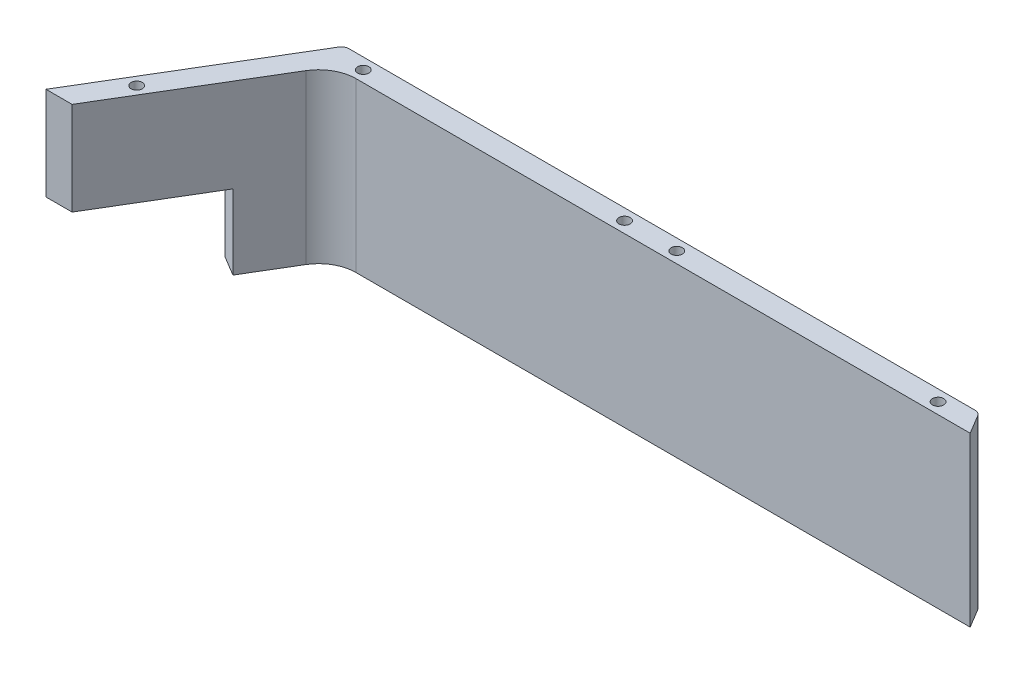
ISO-10303-21;
HEADER;
FILE_DESCRIPTION(('STEP AP214'),'2;1');
FILE_NAME('part.step','',(''),(''),'','','');
FILE_SCHEMA(('AUTOMOTIVE_DESIGN { 1 0 10303 214 1 1 1 1 }'));
ENDSEC;
DATA;
#1=APPLICATION_CONTEXT('core data for automotive mechanical design processes');
#2=APPLICATION_PROTOCOL_DEFINITION('international standard','automotive_design',2000,#1);
#3=PRODUCT_CONTEXT('',#1,'mechanical');
#4=PRODUCT('Part','Part','',(#3));
#5=PRODUCT_RELATED_PRODUCT_CATEGORY('part','',(#4));
#6=PRODUCT_DEFINITION_FORMATION('','',#4);
#7=PRODUCT_DEFINITION_CONTEXT('part definition',#1,'design');
#8=PRODUCT_DEFINITION('design','',#6,#7);
#9=PRODUCT_DEFINITION_SHAPE('','',#8);
#10=(LENGTH_UNIT() NAMED_UNIT(*) SI_UNIT(.MILLI.,.METRE.));
#11=(NAMED_UNIT(*) PLANE_ANGLE_UNIT() SI_UNIT($,.RADIAN.));
#12=(NAMED_UNIT(*) SI_UNIT($,.STERADIAN.) SOLID_ANGLE_UNIT());
#13=UNCERTAINTY_MEASURE_WITH_UNIT(LENGTH_MEASURE(1.E-05),#10,'distance_accuracy_value','');
#14=(GEOMETRIC_REPRESENTATION_CONTEXT(3) GLOBAL_UNCERTAINTY_ASSIGNED_CONTEXT((#13)) GLOBAL_UNIT_ASSIGNED_CONTEXT((#10,
#11,#12)) REPRESENTATION_CONTEXT('',''));
#15=CARTESIAN_POINT('',(0.,0.,0.));
#16=DIRECTION('',(0.,0.,1.));
#17=DIRECTION('',(1.,0.,0.));
#18=AXIS2_PLACEMENT_3D('',#15,#16,#17);
#19=CARTESIAN_POINT('',(0.,-22.5,0.));
#20=DIRECTION('',(0.,-1.,0.));
#21=DIRECTION('',(0.,0.,-1.));
#22=AXIS2_PLACEMENT_3D('',#19,#20,#21);
#23=PLANE('',#22);
#24=DIRECTION('',(-0.514495755427526,0.,-0.857492925712544));
#25=VECTOR('',#24,1.);
#26=CARTESIAN_POINT('',(115.,-22.5,1.74329600357084E-13));
#27=LINE('',#26,#25);
#28=CARTESIAN_POINT('',(88.6,-22.5,-43.9999999999998));
#29=VERTEX_POINT('',#28);
#30=CARTESIAN_POINT('',(85.582605093487,-22.5,-49.0289915108549));
#31=VERTEX_POINT('',#30);
#32=EDGE_CURVE('E160',#29,#31,#27,.T.);
#33=ORIENTED_EDGE('',*,*,#32,.F.);
#34=DIRECTION('',(1.,0.,0.));
#35=VECTOR('',#34,1.);
#36=CARTESIAN_POINT('',(81.6,-22.5,-43.9999999999998));
#37=LINE('',#36,#35);
#38=CARTESIAN_POINT('',(-75.9380962103094,-22.5,-43.9999999999998));
#39=VERTEX_POINT('',#38);
#40=EDGE_CURVE('E132',#39,#29,#37,.T.);
#41=ORIENTED_EDGE('',*,*,#40,.F.);
#42=CARTESIAN_POINT('',(-75.9380962103094,-22.5,-33.9999999999998));
#43=DIRECTION('',(0.,-1.,0.));
#44=DIRECTION('',(0.,0.,-1.));
#45=AXIS2_PLACEMENT_3D('',#42,#43,#44);
#46=CIRCLE('',#45,10.);
#47=CARTESIAN_POINT('',(-84.5130254674349,-22.5,-39.1449575542751));
#48=VERTEX_POINT('',#47);
#49=EDGE_CURVE('E50',#39,#48,#46,.F.);
#50=ORIENTED_EDGE('',*,*,#49,.T.);
#51=DIRECTION('',(0.514495755427526,0.,-0.857492925712545));
#52=VECTOR('',#51,1.);
#53=CARTESIAN_POINT('',(-81.6,-22.5,-43.9999999999998));
#54=LINE('',#53,#52);
#55=CARTESIAN_POINT('',(-91.8455897365072,-22.5,-26.9240171058212));
#56=VERTEX_POINT('',#55);
#57=EDGE_CURVE('E155',#56,#48,#54,.T.);
#58=ORIENTED_EDGE('',*,*,#57,.F.);
#59=DIRECTION('',(-0.857492925712544,0.,-0.514495755427526));
#60=VECTOR('',#59,1.);
#61=CARTESIAN_POINT('',(-88.4177193029112,-22.5,-24.8672948456636));
#62=LINE('',#61,#60);
#63=CARTESIAN_POINT('',(-96.9926485600366,-22.5,-30.0122523999389));
#64=VERTEX_POINT('',#63);
#65=EDGE_CURVE('E186',#56,#64,#62,.T.);
#66=ORIENTED_EDGE('',*,*,#65,.T.);
#67=DIRECTION('',(-0.514495755427526,0.,0.857492925712544));
#68=VECTOR('',#67,1.);
#69=CARTESIAN_POINT('',(-115.,-22.5,1.74329600357084E-13));
#70=LINE('',#69,#68);
#71=CARTESIAN_POINT('',(-85.582605093487,-22.5,-49.0289915108549));
#72=VERTEX_POINT('',#71);
#73=EDGE_CURVE('E162',#72,#64,#70,.T.);
#74=ORIENTED_EDGE('',*,*,#73,.F.);
#75=CARTESIAN_POINT('',(-83.8676192420619,-22.5,-47.9999999999998));
#76=DIRECTION('',(0.,-1.,0.));
#77=DIRECTION('',(0.,0.,-1.));
#78=AXIS2_PLACEMENT_3D('',#75,#76,#77);
#79=CIRCLE('',#78,2.);
#80=CARTESIAN_POINT('',(-83.8676192420619,-22.5,-49.9999999999998));
#81=VERTEX_POINT('',#80);
#82=EDGE_CURVE('E176',#72,#81,#79,.T.);
#83=ORIENTED_EDGE('',*,*,#82,.T.);
#84=DIRECTION('',(-1.,0.,0.));
#85=VECTOR('',#84,1.);
#86=CARTESIAN_POINT('',(-85.,-22.5,-49.9999999999998));
#87=LINE('',#86,#85);
#88=CARTESIAN_POINT('',(83.8676192420619,-22.5,-49.9999999999998));
#89=VERTEX_POINT('',#88);
#90=EDGE_CURVE('E156',#89,#81,#87,.T.);
#91=ORIENTED_EDGE('',*,*,#90,.F.);
#92=CARTESIAN_POINT('',(83.8676192420619,-22.5,-47.9999999999998));
#93=DIRECTION('',(0.,-1.,0.));
#94=DIRECTION('',(0.,0.,-1.));
#95=AXIS2_PLACEMENT_3D('',#92,#93,#94);
#96=CIRCLE('',#95,2.);
#97=EDGE_CURVE('E178',#89,#31,#96,.T.);
#98=ORIENTED_EDGE('',*,*,#97,.T.);
#99=EDGE_LOOP('',(#33,#41,#50,#58,#66,#74,#83,#91,#98));
#100=FACE_BOUND('',#99,.T.);
#101=ADVANCED_FACE('F39',(#100),#23,.T.);
#102=CARTESIAN_POINT('',(115.,22.5,1.74329600357084E-13));
#103=DIRECTION('',(-0.857492925712544,0.,0.514495755427526));
#104=DIRECTION('',(0.514495755427526,0.,0.857492925712544));
#105=AXIS2_PLACEMENT_3D('',#102,#103,#104);
#106=PLANE('',#105);
#107=DIRECTION('',(0.,1.,0.));
#108=VECTOR('',#107,1.);
#109=CARTESIAN_POINT('',(88.6,22.5,-43.9999999999998));
#110=LINE('',#109,#108);
#111=CARTESIAN_POINT('',(88.6,22.5,-43.9999999999998));
#112=VERTEX_POINT('',#111);
#113=EDGE_CURVE('E135',#29,#112,#110,.T.);
#114=ORIENTED_EDGE('',*,*,#113,.F.);
#115=ORIENTED_EDGE('',*,*,#32,.T.);
#116=DIRECTION('',(0.,-1.,0.));
#117=VECTOR('',#116,1.);
#118=CARTESIAN_POINT('',(85.582605093487,22.5,-49.0289915108549));
#119=LINE('',#118,#117);
#120=CARTESIAN_POINT('',(85.582605093487,22.5,-49.0289915108549));
#121=VERTEX_POINT('',#120);
#122=EDGE_CURVE('E145',#31,#121,#119,.F.);
#123=ORIENTED_EDGE('',*,*,#122,.T.);
#124=DIRECTION('',(-0.514495755427526,0.,-0.857492925712544));
#125=VECTOR('',#124,1.);
#126=CARTESIAN_POINT('',(115.,22.5,1.74329600357084E-13));
#127=LINE('',#126,#125);
#128=EDGE_CURVE('E121',#112,#121,#127,.T.);
#129=ORIENTED_EDGE('',*,*,#128,.F.);
#130=EDGE_LOOP('',(#114,#115,#123,#129));
#131=FACE_BOUND('',#130,.T.);
#132=ADVANCED_FACE('F138',(#131),#106,.F.);
#133=CARTESIAN_POINT('',(0.,22.5,0.));
#134=DIRECTION('',(0.,-1.,0.));
#135=DIRECTION('',(0.,0.,-1.));
#136=AXIS2_PLACEMENT_3D('',#133,#134,#135);
#137=PLANE('',#136);
#138=CARTESIAN_POINT('',(77.,22.5,-46.9999999999998));
#139=DIRECTION('',(0.,1.,0.));
#140=DIRECTION('',(0.,0.,-1.));
#141=AXIS2_PLACEMENT_3D('',#138,#139,#140);
#142=CIRCLE('',#141,1.5);
#143=CARTESIAN_POINT('',(77.,22.5,-48.4999999999998));
#144=VERTEX_POINT('',#143);
#145=EDGE_CURVE('E226',#144,#144,#142,.T.);
#146=ORIENTED_EDGE('',*,*,#145,.F.);
#147=EDGE_LOOP('',(#146));
#148=FACE_BOUND('',#147,.T.);
#149=CARTESIAN_POINT('',(7.00000000000001,22.5,-46.9999999999998));
#150=DIRECTION('',(0.,1.,0.));
#151=DIRECTION('',(0.,0.,-1.));
#152=AXIS2_PLACEMENT_3D('',#149,#150,#151);
#153=CIRCLE('',#152,1.5);
#154=CARTESIAN_POINT('',(7.00000000000001,22.5,-48.4999999999998));
#155=VERTEX_POINT('',#154);
#156=EDGE_CURVE('E232',#155,#155,#153,.T.);
#157=ORIENTED_EDGE('',*,*,#156,.F.);
#158=EDGE_LOOP('',(#157));
#159=FACE_BOUND('',#158,.T.);
#160=CARTESIAN_POINT('',(-7.00000000000001,22.5,-46.9999999999998));
#161=DIRECTION('',(0.,1.,0.));
#162=DIRECTION('',(0.,0.,1.));
#163=AXIS2_PLACEMENT_3D('',#160,#161,#162);
#164=CIRCLE('',#163,1.5);
#165=CARTESIAN_POINT('',(-7.00000000000001,22.5,-45.4999999999998));
#166=VERTEX_POINT('',#165);
#167=EDGE_CURVE('E241',#166,#166,#164,.T.);
#168=ORIENTED_EDGE('',*,*,#167,.F.);
#169=EDGE_LOOP('',(#168));
#170=FACE_BOUND('',#169,.T.);
#171=CARTESIAN_POINT('',(-77.,22.5,-46.9999999999998));
#172=DIRECTION('',(0.,1.,0.));
#173=DIRECTION('',(0.,0.,1.));
#174=AXIS2_PLACEMENT_3D('',#171,#172,#173);
#175=CIRCLE('',#174,1.5);
#176=CARTESIAN_POINT('',(-77.,22.5,-45.4999999999998));
#177=VERTEX_POINT('',#176);
#178=EDGE_CURVE('E250',#177,#177,#175,.T.);
#179=ORIENTED_EDGE('',*,*,#178,.F.);
#180=EDGE_LOOP('',(#179));
#181=FACE_BOUND('',#180,.T.);
#182=CARTESIAN_POINT('',(-103.701428863093,22.5,-12.9999999999998));
#183=DIRECTION('',(0.,1.,0.));
#184=DIRECTION('',(0.,0.,1.));
#185=AXIS2_PLACEMENT_3D('',#182,#183,#184);
#186=CIRCLE('',#185,1.5);
#187=CARTESIAN_POINT('',(-103.701428863093,22.5,-11.4999999999998));
#188=VERTEX_POINT('',#187);
#189=EDGE_CURVE('E249',#188,#188,#186,.T.);
#190=ORIENTED_EDGE('',*,*,#189,.F.);
#191=EDGE_LOOP('',(#190));
#192=FACE_BOUND('',#191,.T.);
#193=DIRECTION('',(0.514495755427526,0.,-0.857492925712545));
#194=VECTOR('',#193,1.);
#195=CARTESIAN_POINT('',(-81.6,22.5,-43.9999999999998));
#196=LINE('',#195,#194);
#197=CARTESIAN_POINT('',(-108.,22.5,1.73472347597681E-13));
#198=VERTEX_POINT('',#197);
#199=CARTESIAN_POINT('',(-84.5130254674349,22.5,-39.1449575542751));
#200=VERTEX_POINT('',#199);
#201=EDGE_CURVE('E127',#198,#200,#196,.T.);
#202=ORIENTED_EDGE('',*,*,#201,.T.);
#203=CARTESIAN_POINT('',(-75.9380962103094,22.5,-33.9999999999998));
#204=DIRECTION('',(0.,-1.,0.));
#205=DIRECTION('',(0.,0.,-1.));
#206=AXIS2_PLACEMENT_3D('',#203,#204,#205);
#207=CIRCLE('',#206,10.);
#208=CARTESIAN_POINT('',(-75.9380962103094,22.5,-43.9999999999998));
#209=VERTEX_POINT('',#208);
#210=EDGE_CURVE('E11',#200,#209,#207,.T.);
#211=ORIENTED_EDGE('',*,*,#210,.T.);
#212=DIRECTION('',(1.,0.,0.));
#213=VECTOR('',#212,1.);
#214=CARTESIAN_POINT('',(81.6,22.5,-43.9999999999998));
#215=LINE('',#214,#213);
#216=EDGE_CURVE('E119',#209,#112,#215,.T.);
#217=ORIENTED_EDGE('',*,*,#216,.T.);
#218=ORIENTED_EDGE('',*,*,#128,.T.);
#219=CARTESIAN_POINT('',(83.8676192420619,22.5,-47.9999999999998));
#220=DIRECTION('',(0.,-1.,0.));
#221=DIRECTION('',(0.,0.,-1.));
#222=AXIS2_PLACEMENT_3D('',#219,#220,#221);
#223=CIRCLE('',#222,2.);
#224=CARTESIAN_POINT('',(83.8676192420619,22.5,-49.9999999999998));
#225=VERTEX_POINT('',#224);
#226=EDGE_CURVE('E183',#121,#225,#223,.F.);
#227=ORIENTED_EDGE('',*,*,#226,.T.);
#228=DIRECTION('',(-1.,0.,0.));
#229=VECTOR('',#228,1.);
#230=CARTESIAN_POINT('',(-85.,22.5,-49.9999999999998));
#231=LINE('',#230,#229);
#232=CARTESIAN_POINT('',(-83.8676192420619,22.5,-49.9999999999998));
#233=VERTEX_POINT('',#232);
#234=EDGE_CURVE('E144',#225,#233,#231,.T.);
#235=ORIENTED_EDGE('',*,*,#234,.T.);
#236=CARTESIAN_POINT('',(-83.8676192420619,22.5,-47.9999999999998));
#237=DIRECTION('',(0.,-1.,0.));
#238=DIRECTION('',(0.,0.,-1.));
#239=AXIS2_PLACEMENT_3D('',#236,#237,#238);
#240=CIRCLE('',#239,2.);
#241=CARTESIAN_POINT('',(-85.582605093487,22.5,-49.0289915108549));
#242=VERTEX_POINT('',#241);
#243=EDGE_CURVE('E185',#233,#242,#240,.F.);
#244=ORIENTED_EDGE('',*,*,#243,.T.);
#245=DIRECTION('',(-0.514495755427526,0.,0.857492925712544));
#246=VECTOR('',#245,1.);
#247=CARTESIAN_POINT('',(-115.,22.5,1.74329600357084E-13));
#248=LINE('',#247,#246);
#249=CARTESIAN_POINT('',(-115.,22.5,1.74329600357084E-13));
#250=VERTEX_POINT('',#249);
#251=EDGE_CURVE('E146',#242,#250,#248,.T.);
#252=ORIENTED_EDGE('',*,*,#251,.T.);
#253=DIRECTION('',(1.,0.,0.));
#254=VECTOR('',#253,1.);
#255=CARTESIAN_POINT('',(-108.,22.5,1.73472347597681E-13));
#256=LINE('',#255,#254);
#257=EDGE_CURVE('E164',#250,#198,#256,.T.);
#258=ORIENTED_EDGE('',*,*,#257,.T.);
#259=EDGE_LOOP('',(#202,#211,#217,#218,#227,#235,#244,#252,#258));
#260=FACE_BOUND('',#259,.T.);
#261=ADVANCED_FACE('F125',(#148,#159,#170,#181,#192,#260),#137,.F.);
#262=CARTESIAN_POINT('',(-115.,22.5,1.74329600357084E-13));
#263=DIRECTION('',(0.857492925712544,0.,0.514495755427526));
#264=DIRECTION('',(0.514495755427526,0.,-0.857492925712544));
#265=AXIS2_PLACEMENT_3D('',#262,#263,#264);
#266=PLANE('',#265);
#267=DIRECTION('',(0.,-1.,0.));
#268=VECTOR('',#267,1.);
#269=CARTESIAN_POINT('',(-96.9926485600366,-22.5,-30.0122523999389));
#270=LINE('',#269,#268);
#271=CARTESIAN_POINT('',(-96.9926485600366,-2.50000000000001,-30.0122523999389));
#272=VERTEX_POINT('',#271);
#273=EDGE_CURVE('E139',#272,#64,#270,.T.);
#274=ORIENTED_EDGE('',*,*,#273,.F.);
#275=DIRECTION('',(0.514495755427526,0.,-0.857492925712545));
#276=VECTOR('',#275,1.);
#277=CARTESIAN_POINT('',(-115.,-2.5,1.73472347597681E-13));
#278=LINE('',#277,#276);
#279=CARTESIAN_POINT('',(-115.,-2.5,1.73472347597681E-13));
#280=VERTEX_POINT('',#279);
#281=EDGE_CURVE('E220',#280,#272,#278,.T.);
#282=ORIENTED_EDGE('',*,*,#281,.F.);
#283=DIRECTION('',(0.,-1.,0.));
#284=VECTOR('',#283,1.);
#285=CARTESIAN_POINT('',(-115.,22.5,1.74329600357084E-13));
#286=LINE('',#285,#284);
#287=EDGE_CURVE('E151',#250,#280,#286,.T.);
#288=ORIENTED_EDGE('',*,*,#287,.F.);
#289=ORIENTED_EDGE('',*,*,#251,.F.);
#290=DIRECTION('',(0.,-1.,0.));
#291=VECTOR('',#290,1.);
#292=CARTESIAN_POINT('',(-85.582605093487,22.5,-49.0289915108549));
#293=LINE('',#292,#291);
#294=EDGE_CURVE('E187',#242,#72,#293,.T.);
#295=ORIENTED_EDGE('',*,*,#294,.T.);
#296=ORIENTED_EDGE('',*,*,#73,.T.);
#297=EDGE_LOOP('',(#274,#282,#288,#289,#295,#296));
#298=FACE_BOUND('',#297,.T.);
#299=ADVANCED_FACE('F215',(#298),#266,.F.);
#300=CARTESIAN_POINT('',(-108.,22.5,1.73472347597681E-13));
#301=DIRECTION('',(0.,0.,-1.));
#302=DIRECTION('',(-1.,0.,0.));
#303=AXIS2_PLACEMENT_3D('',#300,#301,#302);
#304=PLANE('',#303);
#305=ORIENTED_EDGE('',*,*,#287,.T.);
#306=DIRECTION('',(1.,0.,0.));
#307=VECTOR('',#306,1.);
#308=CARTESIAN_POINT('',(-108.,-2.5,1.73472347597681E-13));
#309=LINE('',#308,#307);
#310=CARTESIAN_POINT('',(-108.,-2.5,1.73472347597681E-13));
#311=VERTEX_POINT('',#310);
#312=EDGE_CURVE('E230',#280,#311,#309,.T.);
#313=ORIENTED_EDGE('',*,*,#312,.T.);
#314=DIRECTION('',(0.,-1.,0.));
#315=VECTOR('',#314,1.);
#316=CARTESIAN_POINT('',(-108.,22.5,1.73472347597681E-13));
#317=LINE('',#316,#315);
#318=EDGE_CURVE('E166',#198,#311,#317,.T.);
#319=ORIENTED_EDGE('',*,*,#318,.F.);
#320=ORIENTED_EDGE('',*,*,#257,.F.);
#321=EDGE_LOOP('',(#305,#313,#319,#320));
#322=FACE_BOUND('',#321,.T.);
#323=ADVANCED_FACE('F225',(#322),#304,.F.);
#324=CARTESIAN_POINT('',(-81.6,22.5,-43.9999999999998));
#325=DIRECTION('',(-0.857492925712545,0.,-0.514495755427526));
#326=DIRECTION('',(-0.514495755427526,0.,0.857492925712545));
#327=AXIS2_PLACEMENT_3D('',#324,#325,#326);
#328=PLANE('',#327);
#329=ORIENTED_EDGE('',*,*,#57,.T.);
#330=DIRECTION('',(0.,-1.,0.));
#331=VECTOR('',#330,1.);
#332=CARTESIAN_POINT('',(-84.5130254674349,22.5,-39.1449575542751));
#333=LINE('',#332,#331);
#334=EDGE_CURVE('E53',#48,#200,#333,.F.);
#335=ORIENTED_EDGE('',*,*,#334,.T.);
#336=ORIENTED_EDGE('',*,*,#201,.F.);
#337=ORIENTED_EDGE('',*,*,#318,.T.);
#338=DIRECTION('',(0.514495755427526,0.,-0.857492925712545));
#339=VECTOR('',#338,1.);
#340=CARTESIAN_POINT('',(-81.6,-2.50000000000001,-43.9999999999998));
#341=LINE('',#340,#339);
#342=CARTESIAN_POINT('',(-91.8455897365072,-2.5,-26.9240171058212));
#343=VERTEX_POINT('',#342);
#344=EDGE_CURVE('E188',#311,#343,#341,.T.);
#345=ORIENTED_EDGE('',*,*,#344,.T.);
#346=DIRECTION('',(0.,-1.,0.));
#347=VECTOR('',#346,1.);
#348=CARTESIAN_POINT('',(-91.8455897365072,22.5,-26.9240171058212));
#349=LINE('',#348,#347);
#350=EDGE_CURVE('E259',#343,#56,#349,.T.);
#351=ORIENTED_EDGE('',*,*,#350,.T.);
#352=EDGE_LOOP('',(#329,#335,#336,#337,#345,#351));
#353=FACE_BOUND('',#352,.T.);
#354=ADVANCED_FACE('F270',(#353),#328,.F.);
#355=CARTESIAN_POINT('',(81.6,22.5,-43.9999999999998));
#356=DIRECTION('',(0.,0.,-1.));
#357=DIRECTION('',(-1.,0.,0.));
#358=AXIS2_PLACEMENT_3D('',#355,#356,#357);
#359=PLANE('',#358);
#360=ORIENTED_EDGE('',*,*,#216,.F.);
#361=DIRECTION('',(0.,-1.,0.));
#362=VECTOR('',#361,1.);
#363=CARTESIAN_POINT('',(-75.9380962103094,-22.5,-43.9999999999998));
#364=LINE('',#363,#362);
#365=EDGE_CURVE('E195',#209,#39,#364,.T.);
#366=ORIENTED_EDGE('',*,*,#365,.T.);
#367=ORIENTED_EDGE('',*,*,#40,.T.);
#368=ORIENTED_EDGE('',*,*,#113,.T.);
#369=EDGE_LOOP('',(#360,#366,#367,#368));
#370=FACE_BOUND('',#369,.T.);
#371=ADVANCED_FACE('F133',(#370),#359,.F.);
#372=CARTESIAN_POINT('',(-85.,22.5,-49.9999999999998));
#373=DIRECTION('',(0.,0.,1.));
#374=DIRECTION('',(1.,0.,0.));
#375=AXIS2_PLACEMENT_3D('',#372,#373,#374);
#376=PLANE('',#375);
#377=ORIENTED_EDGE('',*,*,#234,.F.);
#378=DIRECTION('',(0.,-1.,0.));
#379=VECTOR('',#378,1.);
#380=CARTESIAN_POINT('',(83.8676192420619,22.5,-49.9999999999998));
#381=LINE('',#380,#379);
#382=EDGE_CURVE('E173',#225,#89,#381,.T.);
#383=ORIENTED_EDGE('',*,*,#382,.T.);
#384=ORIENTED_EDGE('',*,*,#90,.T.);
#385=DIRECTION('',(0.,-1.,0.));
#386=VECTOR('',#385,1.);
#387=CARTESIAN_POINT('',(-83.8676192420619,22.5,-49.9999999999998));
#388=LINE('',#387,#386);
#389=EDGE_CURVE('E171',#81,#233,#388,.F.);
#390=ORIENTED_EDGE('',*,*,#389,.T.);
#391=EDGE_LOOP('',(#377,#383,#384,#390));
#392=FACE_BOUND('',#391,.T.);
#393=ADVANCED_FACE('F204',(#392),#376,.F.);
#394=CARTESIAN_POINT('',(77.,17.5,-46.9999999999998));
#395=DIRECTION('',(0.,1.,0.));
#396=DIRECTION('',(0.,0.,1.));
#397=AXIS2_PLACEMENT_3D('',#394,#395,#396);
#398=CYLINDRICAL_SURFACE('',#397,1.5);
#399=CARTESIAN_POINT('',(77.,17.5,-46.9999999999998));
#400=DIRECTION('',(0.,1.,0.));
#401=DIRECTION('',(0.,0.,-1.));
#402=AXIS2_PLACEMENT_3D('',#399,#400,#401);
#403=CIRCLE('',#402,1.5);
#404=CARTESIAN_POINT('',(77.,17.5,-48.4999999999998));
#405=VERTEX_POINT('',#404);
#406=EDGE_CURVE('E223',#405,#405,#403,.T.);
#407=ORIENTED_EDGE('',*,*,#406,.F.);
#408=EDGE_LOOP('',(#407));
#409=FACE_BOUND('',#408,.T.);
#410=ORIENTED_EDGE('',*,*,#145,.T.);
#411=EDGE_LOOP('',(#410));
#412=FACE_BOUND('',#411,.T.);
#413=ADVANCED_FACE('F289',(#409,#412),#398,.F.);
#414=CARTESIAN_POINT('',(77.,17.5,-46.9999999999998));
#415=DIRECTION('',(0.,-1.,0.));
#416=DIRECTION('',(0.,0.,-1.));
#417=AXIS2_PLACEMENT_3D('',#414,#415,#416);
#418=PLANE('',#417);
#419=ORIENTED_EDGE('',*,*,#406,.T.);
#420=EDGE_LOOP('',(#419));
#421=FACE_BOUND('',#420,.T.);
#422=ADVANCED_FACE('F334',(#421),#418,.F.);
#423=CARTESIAN_POINT('',(7.00000000000001,17.5,-46.9999999999998));
#424=DIRECTION('',(0.,1.,0.));
#425=DIRECTION('',(0.,0.,1.));
#426=AXIS2_PLACEMENT_3D('',#423,#424,#425);
#427=CYLINDRICAL_SURFACE('',#426,1.5);
#428=CARTESIAN_POINT('',(7.00000000000001,17.5,-46.9999999999998));
#429=DIRECTION('',(0.,1.,0.));
#430=DIRECTION('',(0.,0.,-1.));
#431=AXIS2_PLACEMENT_3D('',#428,#429,#430);
#432=CIRCLE('',#431,1.5);
#433=CARTESIAN_POINT('',(7.00000000000001,17.5,-48.4999999999998));
#434=VERTEX_POINT('',#433);
#435=EDGE_CURVE('E235',#434,#434,#432,.T.);
#436=ORIENTED_EDGE('',*,*,#435,.F.);
#437=EDGE_LOOP('',(#436));
#438=FACE_BOUND('',#437,.T.);
#439=ORIENTED_EDGE('',*,*,#156,.T.);
#440=EDGE_LOOP('',(#439));
#441=FACE_BOUND('',#440,.T.);
#442=ADVANCED_FACE('F327',(#438,#441),#427,.F.);
#443=CARTESIAN_POINT('',(7.00000000000001,17.5,-46.9999999999998));
#444=DIRECTION('',(0.,-1.,0.));
#445=DIRECTION('',(0.,0.,-1.));
#446=AXIS2_PLACEMENT_3D('',#443,#444,#445);
#447=PLANE('',#446);
#448=ORIENTED_EDGE('',*,*,#435,.T.);
#449=EDGE_LOOP('',(#448));
#450=FACE_BOUND('',#449,.T.);
#451=ADVANCED_FACE('F322',(#450),#447,.F.);
#452=CARTESIAN_POINT('',(-7.00000000000001,17.5,-46.9999999999998));
#453=DIRECTION('',(0.,1.,0.));
#454=DIRECTION('',(0.,0.,1.));
#455=AXIS2_PLACEMENT_3D('',#452,#453,#454);
#456=CYLINDRICAL_SURFACE('',#455,1.5);
#457=CARTESIAN_POINT('',(-7.00000000000001,17.5,-46.9999999999998));
#458=DIRECTION('',(0.,1.,0.));
#459=DIRECTION('',(0.,0.,1.));
#460=AXIS2_PLACEMENT_3D('',#457,#458,#459);
#461=CIRCLE('',#460,1.5);
#462=CARTESIAN_POINT('',(-7.00000000000001,17.5,-45.4999999999998));
#463=VERTEX_POINT('',#462);
#464=EDGE_CURVE('E238',#463,#463,#461,.T.);
#465=ORIENTED_EDGE('',*,*,#464,.F.);
#466=EDGE_LOOP('',(#465));
#467=FACE_BOUND('',#466,.T.);
#468=ORIENTED_EDGE('',*,*,#167,.T.);
#469=EDGE_LOOP('',(#468));
#470=FACE_BOUND('',#469,.T.);
#471=ADVANCED_FACE('F321',(#467,#470),#456,.F.);
#472=CARTESIAN_POINT('',(-7.00000000000001,17.5,-46.9999999999998));
#473=DIRECTION('',(0.,1.,0.));
#474=DIRECTION('',(0.,0.,1.));
#475=AXIS2_PLACEMENT_3D('',#472,#473,#474);
#476=PLANE('',#475);
#477=ORIENTED_EDGE('',*,*,#464,.T.);
#478=EDGE_LOOP('',(#477));
#479=FACE_BOUND('',#478,.T.);
#480=ADVANCED_FACE('F320',(#479),#476,.T.);
#481=CARTESIAN_POINT('',(-77.,17.5,-46.9999999999998));
#482=DIRECTION('',(0.,1.,0.));
#483=DIRECTION('',(0.,0.,1.));
#484=AXIS2_PLACEMENT_3D('',#481,#482,#483);
#485=CYLINDRICAL_SURFACE('',#484,1.5);
#486=CARTESIAN_POINT('',(-77.,17.5,-46.9999999999998));
#487=DIRECTION('',(0.,1.,0.));
#488=DIRECTION('',(0.,0.,1.));
#489=AXIS2_PLACEMENT_3D('',#486,#487,#488);
#490=CIRCLE('',#489,1.5);
#491=CARTESIAN_POINT('',(-77.,17.5,-45.4999999999998));
#492=VERTEX_POINT('',#491);
#493=EDGE_CURVE('E242',#492,#492,#490,.T.);
#494=ORIENTED_EDGE('',*,*,#493,.F.);
#495=EDGE_LOOP('',(#494));
#496=FACE_BOUND('',#495,.T.);
#497=ORIENTED_EDGE('',*,*,#178,.T.);
#498=EDGE_LOOP('',(#497));
#499=FACE_BOUND('',#498,.T.);
#500=ADVANCED_FACE('F313',(#496,#499),#485,.F.);
#501=CARTESIAN_POINT('',(-77.,17.5,-46.9999999999998));
#502=DIRECTION('',(0.,1.,0.));
#503=DIRECTION('',(0.,0.,1.));
#504=AXIS2_PLACEMENT_3D('',#501,#502,#503);
#505=PLANE('',#504);
#506=ORIENTED_EDGE('',*,*,#493,.T.);
#507=EDGE_LOOP('',(#506));
#508=FACE_BOUND('',#507,.T.);
#509=ADVANCED_FACE('F315',(#508),#505,.T.);
#510=CARTESIAN_POINT('',(-103.701428863093,17.5,-12.9999999999998));
#511=DIRECTION('',(0.,1.,0.));
#512=DIRECTION('',(0.,0.,1.));
#513=AXIS2_PLACEMENT_3D('',#510,#511,#512);
#514=CYLINDRICAL_SURFACE('',#513,1.5);
#515=CARTESIAN_POINT('',(-103.701428863093,17.5,-12.9999999999998));
#516=DIRECTION('',(0.,1.,0.));
#517=DIRECTION('',(0.,0.,1.));
#518=AXIS2_PLACEMENT_3D('',#515,#516,#517);
#519=CIRCLE('',#518,1.5);
#520=CARTESIAN_POINT('',(-103.701428863093,17.5,-11.4999999999998));
#521=VERTEX_POINT('',#520);
#522=EDGE_CURVE('E152',#521,#521,#519,.T.);
#523=ORIENTED_EDGE('',*,*,#522,.F.);
#524=EDGE_LOOP('',(#523));
#525=FACE_BOUND('',#524,.T.);
#526=ORIENTED_EDGE('',*,*,#189,.T.);
#527=EDGE_LOOP('',(#526));
#528=FACE_BOUND('',#527,.T.);
#529=ADVANCED_FACE('F308',(#525,#528),#514,.F.);
#530=CARTESIAN_POINT('',(-103.701428863093,17.5,-12.9999999999998));
#531=DIRECTION('',(0.,1.,0.));
#532=DIRECTION('',(0.,0.,1.));
#533=AXIS2_PLACEMENT_3D('',#530,#531,#532);
#534=PLANE('',#533);
#535=ORIENTED_EDGE('',*,*,#522,.T.);
#536=EDGE_LOOP('',(#535));
#537=FACE_BOUND('',#536,.T.);
#538=ADVANCED_FACE('F298',(#537),#534,.T.);
#539=CARTESIAN_POINT('',(83.8676192420619,22.5,-47.9999999999998));
#540=DIRECTION('',(0.,-1.,0.));
#541=DIRECTION('',(0.,0.,-1.));
#542=AXIS2_PLACEMENT_3D('',#539,#540,#541);
#543=CYLINDRICAL_SURFACE('',#542,2.);
#544=ORIENTED_EDGE('',*,*,#226,.F.);
#545=ORIENTED_EDGE('',*,*,#122,.F.);
#546=ORIENTED_EDGE('',*,*,#97,.F.);
#547=ORIENTED_EDGE('',*,*,#382,.F.);
#548=EDGE_LOOP('',(#544,#545,#546,#547));
#549=FACE_BOUND('',#548,.T.);
#550=ADVANCED_FACE('F198',(#549),#543,.T.);
#551=CARTESIAN_POINT('',(-83.8676192420619,22.5,-47.9999999999998));
#552=DIRECTION('',(0.,-1.,0.));
#553=DIRECTION('',(0.,0.,-1.));
#554=AXIS2_PLACEMENT_3D('',#551,#552,#553);
#555=CYLINDRICAL_SURFACE('',#554,2.);
#556=ORIENTED_EDGE('',*,*,#243,.F.);
#557=ORIENTED_EDGE('',*,*,#389,.F.);
#558=ORIENTED_EDGE('',*,*,#82,.F.);
#559=ORIENTED_EDGE('',*,*,#294,.F.);
#560=EDGE_LOOP('',(#556,#557,#558,#559));
#561=FACE_BOUND('',#560,.T.);
#562=ADVANCED_FACE('F207',(#561),#555,.T.);
#563=CARTESIAN_POINT('',(-106.425070742875,-2.5,5.14495755427544));
#564=DIRECTION('',(0.,1.,0.));
#565=DIRECTION('',(0.,0.,1.));
#566=AXIS2_PLACEMENT_3D('',#563,#564,#565);
#567=PLANE('',#566);
#568=ORIENTED_EDGE('',*,*,#281,.T.);
#569=DIRECTION('',(-0.857492925712544,0.,-0.514495755427526));
#570=VECTOR('',#569,1.);
#571=CARTESIAN_POINT('',(-88.4177193029112,-2.50000000000001,-24.8672948456636));
#572=LINE('',#571,#570);
#573=EDGE_CURVE('E258',#343,#272,#572,.T.);
#574=ORIENTED_EDGE('',*,*,#573,.F.);
#575=ORIENTED_EDGE('',*,*,#344,.F.);
#576=ORIENTED_EDGE('',*,*,#312,.F.);
#577=EDGE_LOOP('',(#568,#574,#575,#576));
#578=FACE_BOUND('',#577,.T.);
#579=ADVANCED_FACE('F271',(#578),#567,.F.);
#580=CARTESIAN_POINT('',(-88.4177193029112,-22.5,-24.8672948456636));
#581=DIRECTION('',(0.514495755427526,0.,-0.857492925712544));
#582=DIRECTION('',(-0.857492925712544,0.,-0.514495755427526));
#583=AXIS2_PLACEMENT_3D('',#580,#581,#582);
#584=PLANE('',#583);
#585=ORIENTED_EDGE('',*,*,#573,.T.);
#586=ORIENTED_EDGE('',*,*,#273,.T.);
#587=ORIENTED_EDGE('',*,*,#65,.F.);
#588=ORIENTED_EDGE('',*,*,#350,.F.);
#589=EDGE_LOOP('',(#585,#586,#587,#588));
#590=FACE_BOUND('',#589,.T.);
#591=ADVANCED_FACE('F262',(#590),#584,.F.);
#592=CARTESIAN_POINT('',(-75.9380962103094,22.5,-33.9999999999998));
#593=DIRECTION('',(0.,1.,0.));
#594=DIRECTION('',(0.,0.,1.));
#595=AXIS2_PLACEMENT_3D('',#592,#593,#594);
#596=CYLINDRICAL_SURFACE('',#595,10.);
#597=ORIENTED_EDGE('',*,*,#210,.F.);
#598=ORIENTED_EDGE('',*,*,#334,.F.);
#599=ORIENTED_EDGE('',*,*,#49,.F.);
#600=ORIENTED_EDGE('',*,*,#365,.F.);
#601=EDGE_LOOP('',(#597,#598,#599,#600));
#602=FACE_BOUND('',#601,.T.);
#603=ADVANCED_FACE('F41',(#602),#596,.F.);
#604=CLOSED_SHELL('',(#101,#132,#261,#299,#323,#354,#371,#393,#413,#422,#442,#451,#471,#480,
#500,#509,#529,#538,#550,#562,#579,#591,#603));
#605=MANIFOLD_SOLID_BREP('B2',#604);
#606=ADVANCED_BREP_SHAPE_REPRESENTATION('',(#18,#605),#14);
#607=SHAPE_DEFINITION_REPRESENTATION(#9,#606);
ENDSEC;
END-ISO-10303-21;
